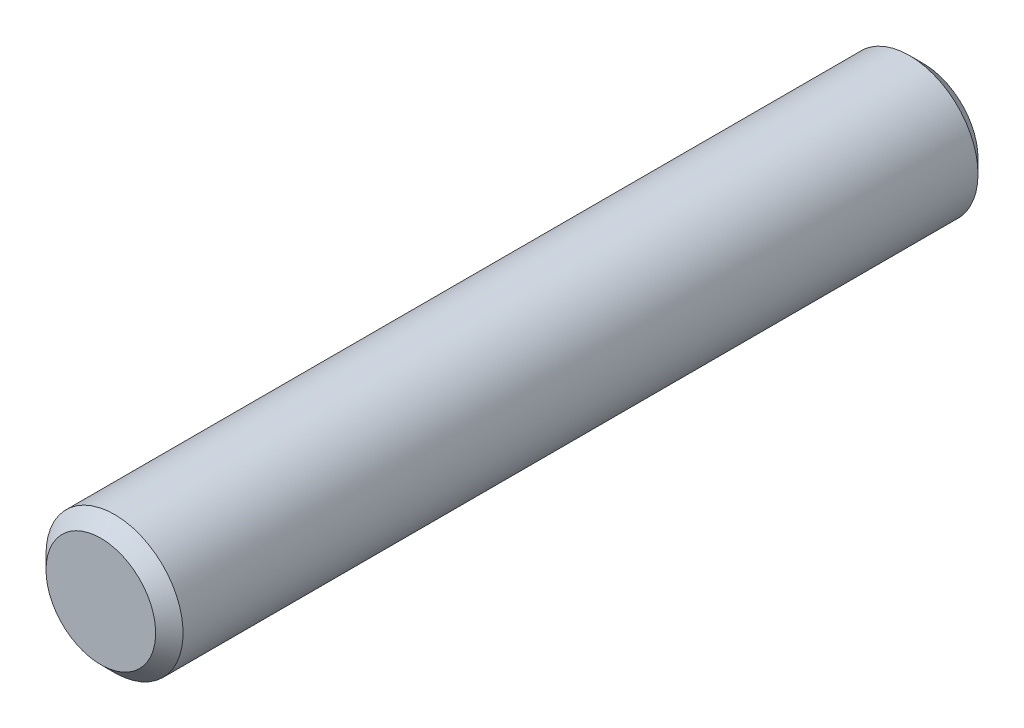
ISO-10303-21;
HEADER;
FILE_DESCRIPTION(('STEP AP214'),'2;1');
FILE_NAME('part.step','',(''),(''),'','','');
FILE_SCHEMA(('AUTOMOTIVE_DESIGN { 1 0 10303 214 1 1 1 1 }'));
ENDSEC;
DATA;
#1=APPLICATION_CONTEXT('core data for automotive mechanical design processes');
#2=APPLICATION_PROTOCOL_DEFINITION('international standard','automotive_design',2000,#1);
#3=PRODUCT_CONTEXT('',#1,'mechanical');
#4=PRODUCT('Part','Part','',(#3));
#5=PRODUCT_RELATED_PRODUCT_CATEGORY('part','',(#4));
#6=PRODUCT_DEFINITION_FORMATION('','',#4);
#7=PRODUCT_DEFINITION_CONTEXT('part definition',#1,'design');
#8=PRODUCT_DEFINITION('design','',#6,#7);
#9=PRODUCT_DEFINITION_SHAPE('','',#8);
#10=(LENGTH_UNIT() NAMED_UNIT(*) SI_UNIT(.MILLI.,.METRE.));
#11=(NAMED_UNIT(*) PLANE_ANGLE_UNIT() SI_UNIT($,.RADIAN.));
#12=(NAMED_UNIT(*) SI_UNIT($,.STERADIAN.) SOLID_ANGLE_UNIT());
#13=UNCERTAINTY_MEASURE_WITH_UNIT(LENGTH_MEASURE(1.E-05),#10,'distance_accuracy_value','');
#14=(GEOMETRIC_REPRESENTATION_CONTEXT(3) GLOBAL_UNCERTAINTY_ASSIGNED_CONTEXT((#13)) GLOBAL_UNIT_ASSIGNED_CONTEXT((#10,
#11,#12)) REPRESENTATION_CONTEXT('',''));
#15=CARTESIAN_POINT('',(0.,0.,0.));
#16=DIRECTION('',(0.,0.,1.));
#17=DIRECTION('',(1.,0.,0.));
#18=AXIS2_PLACEMENT_3D('',#15,#16,#17);
#19=CARTESIAN_POINT('',(0.,0.,19.05));
#20=DIRECTION('',(0.,0.,-1.));
#21=DIRECTION('',(-1.,0.,0.));
#22=AXIS2_PLACEMENT_3D('',#19,#20,#21);
#23=CYLINDRICAL_SURFACE('',#22,3.175);
#24=CARTESIAN_POINT('',(0.,0.,-18.415));
#25=DIRECTION('',(0.,0.,1.));
#26=DIRECTION('',(1.,0.,0.));
#27=AXIS2_PLACEMENT_3D('',#24,#25,#26);
#28=CIRCLE('',#27,3.175);
#29=CARTESIAN_POINT('',(-3.175,0.,-18.415));
#30=VERTEX_POINT('',#29);
#31=EDGE_CURVE('E43',#30,#30,#28,.T.);
#32=CARTESIAN_POINT('',(0.,0.,18.415));
#33=DIRECTION('',(0.,0.,1.));
#34=DIRECTION('',(1.,0.,0.));
#35=AXIS2_PLACEMENT_3D('',#32,#33,#34);
#36=CIRCLE('',#35,3.175);
#37=CARTESIAN_POINT('',(-3.175,0.,18.415));
#38=VERTEX_POINT('',#37);
#39=EDGE_CURVE('E47',#38,#38,#36,.F.);
#40=CARTESIAN_POINT('',(-3.175,0.,-18.415));
#41=CARTESIAN_POINT('',(-3.175,0.,-18.0313541666666));
#42=CARTESIAN_POINT('',(-3.175,0.,-17.6477083333333));
#43=CARTESIAN_POINT('',(-3.175,0.,-16.8804166666666));
#44=CARTESIAN_POINT('',(-3.175,0.,-16.4967708333333));
#45=CARTESIAN_POINT('',(-3.175,0.,-15.7294791666666));
#46=CARTESIAN_POINT('',(-3.175,0.,-15.3458333333333));
#47=CARTESIAN_POINT('',(-3.175,0.,-14.5785416666666));
#48=CARTESIAN_POINT('',(-3.175,0.,-14.1948958333333));
#49=CARTESIAN_POINT('',(-3.175,0.,-13.4276041666666));
#50=CARTESIAN_POINT('',(-3.175,0.,-13.0439583333333));
#51=CARTESIAN_POINT('',(-3.175,0.,-12.2766666666666));
#52=CARTESIAN_POINT('',(-3.175,0.,-11.8930208333333));
#53=CARTESIAN_POINT('',(-3.175,0.,-11.1257291666666));
#54=CARTESIAN_POINT('',(-3.175,0.,-10.7420833333333));
#55=CARTESIAN_POINT('',(-3.175,0.,-9.97479166666665));
#56=CARTESIAN_POINT('',(-3.175,0.,-9.59114583333331));
#57=CARTESIAN_POINT('',(-3.175,0.,-8.82385416666665));
#58=CARTESIAN_POINT('',(-3.175,0.,-8.44020833333331));
#59=CARTESIAN_POINT('',(-3.175,0.,-7.67291666666664));
#60=CARTESIAN_POINT('',(-3.175,0.,-7.28927083333331));
#61=CARTESIAN_POINT('',(-3.175,0.,-6.52197916666665));
#62=CARTESIAN_POINT('',(-3.175,0.,-6.13833333333331));
#63=CARTESIAN_POINT('',(-3.175,0.,-5.37104166666665));
#64=CARTESIAN_POINT('',(-3.175,0.,-4.98739583333331));
#65=CARTESIAN_POINT('',(-3.175,0.,-4.22010416666665));
#66=CARTESIAN_POINT('',(-3.175,0.,-3.83645833333331));
#67=CARTESIAN_POINT('',(-3.175,0.,-3.06916666666665));
#68=CARTESIAN_POINT('',(-3.175,0.,-2.68552083333331));
#69=CARTESIAN_POINT('',(-3.175,0.,-1.91822916666665));
#70=CARTESIAN_POINT('',(-3.175,0.,-1.53458333333331));
#71=CARTESIAN_POINT('',(-3.175,0.,-0.767291666666646));
#72=CARTESIAN_POINT('',(-3.175,0.,-0.383645833333313));
#73=CARTESIAN_POINT('',(-3.175,0.,0.383645833333354));
#74=CARTESIAN_POINT('',(-3.175,0.,0.767291666666688));
#75=CARTESIAN_POINT('',(-3.175,0.,1.53458333333336));
#76=CARTESIAN_POINT('',(-3.175,0.,1.91822916666669));
#77=CARTESIAN_POINT('',(-3.175,0.,2.68552083333335));
#78=CARTESIAN_POINT('',(-3.175,0.,3.06916666666669));
#79=CARTESIAN_POINT('',(-3.175,0.,3.83645833333335));
#80=CARTESIAN_POINT('',(-3.175,0.,4.22010416666668));
#81=CARTESIAN_POINT('',(-3.175,0.,4.98739583333335));
#82=CARTESIAN_POINT('',(-3.175,0.,5.37104166666669));
#83=CARTESIAN_POINT('',(-3.175,0.,6.13833333333335));
#84=CARTESIAN_POINT('',(-3.175,0.,6.52197916666669));
#85=CARTESIAN_POINT('',(-3.175,0.,7.28927083333335));
#86=CARTESIAN_POINT('',(-3.175,0.,7.67291666666668));
#87=CARTESIAN_POINT('',(-3.175,0.,8.44020833333335));
#88=CARTESIAN_POINT('',(-3.175,0.,8.82385416666669));
#89=CARTESIAN_POINT('',(-3.175,0.,9.59114583333335));
#90=CARTESIAN_POINT('',(-3.175,0.,9.97479166666669));
#91=CARTESIAN_POINT('',(-3.175,0.,10.7420833333334));
#92=CARTESIAN_POINT('',(-3.175,0.,11.1257291666667));
#93=CARTESIAN_POINT('',(-3.175,0.,11.8930208333334));
#94=CARTESIAN_POINT('',(-3.175,0.,12.2766666666667));
#95=CARTESIAN_POINT('',(-3.175,0.,13.0439583333334));
#96=CARTESIAN_POINT('',(-3.175,0.,13.4276041666667));
#97=CARTESIAN_POINT('',(-3.175,0.,14.1948958333333));
#98=CARTESIAN_POINT('',(-3.175,0.,14.5785416666667));
#99=CARTESIAN_POINT('',(-3.175,0.,15.3458333333334));
#100=CARTESIAN_POINT('',(-3.175,0.,15.7294791666667));
#101=CARTESIAN_POINT('',(-3.175,0.,16.4967708333334));
#102=CARTESIAN_POINT('',(-3.175,0.,16.8804166666667));
#103=CARTESIAN_POINT('',(-3.175,0.,17.6477083333334));
#104=CARTESIAN_POINT('',(-3.175,0.,18.0313541666667));
#105=CARTESIAN_POINT('',(-3.175,0.,18.415));
#106=B_SPLINE_CURVE_WITH_KNOTS('',3,(#40,#41,#42,#43,#44,#45,#46,#47,#48,#49,#50,#51,#52,#53,
#54,#55,#56,#57,#58,#59,#60,#61,#62,#63,#64,#65,#66,#67,#68,#69,#70,#71,#72,#73,#74,#75,#76,#77,
#78,#79,#80,#81,#82,#83,#84,#85,#86,#87,#88,#89,#90,#91,#92,#93,#94,#95,#96,#97,#98,#99,#100,
#101,#102,#103,#104,#105),.UNSPECIFIED.,.F.,.F.,(4,2,2,2,2,2,2,2,2,2,2,2,2,2,2,2,2,2,2,2,2,2,2,
2,2,2,2,2,2,2,2,2,4),(0.,1.1509375,2.301875,3.4528125,4.60375,5.7546875,6.905625,8.0565625,
9.2075,10.3584375,11.509375,12.6603125,13.81125,14.9621875,16.113125,17.2640625,18.415,
19.5659375,20.716875,21.8678125,23.01875,24.1696875,25.320625,26.4715625,27.6225,28.7734375,
29.924375,31.0753125,32.22625,33.3771875,34.528125,35.6790625,36.83),.UNSPECIFIED.);
#107=EDGE_CURVE('BSEAM32',#30,#38,#106,.T.);
#108=ORIENTED_EDGE('',*,*,#31,.T.);
#109=ORIENTED_EDGE('',*,*,#39,.T.);
#110=ORIENTED_EDGE('',*,*,#107,.T.);
#111=ORIENTED_EDGE('',*,*,#107,.F.);
#112=EDGE_LOOP('',(#108,#110,#109,#111));
#113=FACE_BOUND('',#112,.T.);
#114=ADVANCED_FACE('F32',(#113),#23,.T.);
#115=CARTESIAN_POINT('',(0.,0.,19.05));
#116=DIRECTION('',(0.,0.,1.));
#117=DIRECTION('',(1.,0.,0.));
#118=AXIS2_PLACEMENT_3D('',#115,#116,#117);
#119=PLANE('',#118);
#120=CARTESIAN_POINT('',(0.,0.,19.05));
#121=DIRECTION('',(0.,0.,1.));
#122=DIRECTION('',(1.,0.,0.));
#123=AXIS2_PLACEMENT_3D('',#120,#121,#122);
#124=CIRCLE('',#123,2.54000000000002);
#125=CARTESIAN_POINT('',(-2.54000000000002,0.,19.05));
#126=VERTEX_POINT('',#125);
#127=EDGE_CURVE('E10',#126,#126,#124,.T.);
#128=ORIENTED_EDGE('',*,*,#127,.T.);
#129=EDGE_LOOP('',(#128));
#130=FACE_BOUND('',#129,.T.);
#131=ADVANCED_FACE('F63',(#130),#119,.T.);
#132=CARTESIAN_POINT('',(0.,0.,-19.05));
#133=DIRECTION('',(0.,0.,1.));
#134=DIRECTION('',(1.,0.,0.));
#135=AXIS2_PLACEMENT_3D('',#132,#133,#134);
#136=PLANE('',#135);
#137=CARTESIAN_POINT('',(0.,0.,-19.05));
#138=DIRECTION('',(0.,0.,1.));
#139=DIRECTION('',(1.,0.,0.));
#140=AXIS2_PLACEMENT_3D('',#137,#138,#139);
#141=CIRCLE('',#140,2.53999999999997);
#142=CARTESIAN_POINT('',(2.53999999999997,0.,-19.05));
#143=VERTEX_POINT('',#142);
#144=EDGE_CURVE('E39',#143,#143,#141,.F.);
#145=ORIENTED_EDGE('',*,*,#144,.T.);
#146=EDGE_LOOP('',(#145));
#147=FACE_BOUND('',#146,.T.);
#148=ADVANCED_FACE('F60',(#147),#136,.F.);
#149=CARTESIAN_POINT('',(0.,0.,-18.415));
#150=DIRECTION('',(0.,0.,1.));
#151=DIRECTION('',(1.,0.,0.));
#152=AXIS2_PLACEMENT_3D('',#149,#150,#151);
#153=CONICAL_SURFACE('',#152,3.175,0.785398163397454);
#154=ORIENTED_EDGE('',*,*,#144,.F.);
#155=EDGE_LOOP('',(#154));
#156=FACE_BOUND('',#155,.T.);
#157=ORIENTED_EDGE('',*,*,#31,.F.);
#158=EDGE_LOOP('',(#157));
#159=FACE_BOUND('',#158,.T.);
#160=ADVANCED_FACE('F56',(#156,#159),#153,.T.);
#161=CARTESIAN_POINT('',(0.,0.,19.05));
#162=DIRECTION('',(0.,0.,-1.));
#163=DIRECTION('',(-1.,0.,0.));
#164=AXIS2_PLACEMENT_3D('',#161,#162,#163);
#165=CONICAL_SURFACE('',#164,2.54000000000002,0.785398163397448);
#166=CARTESIAN_POINT('',(-3.175,0.,18.415));
#167=CARTESIAN_POINT('',(-3.16838541666667,0.,18.4216145833334));
#168=CARTESIAN_POINT('',(-3.16177083333334,0.,18.4282291666667));
#169=CARTESIAN_POINT('',(-3.14854166666667,0.,18.4414583333333));
#170=CARTESIAN_POINT('',(-3.14192708333334,0.,18.4480729166667));
#171=CARTESIAN_POINT('',(-3.12869791666667,0.,18.4613020833334));
#172=CARTESIAN_POINT('',(-3.12208333333334,0.,18.4679166666667));
#173=CARTESIAN_POINT('',(-3.10885416666667,0.,18.4811458333333));
#174=CARTESIAN_POINT('',(-3.10223958333334,0.,18.4877604166667));
#175=CARTESIAN_POINT('',(-3.08901041666667,0.,18.5009895833333));
#176=CARTESIAN_POINT('',(-3.08239583333334,0.,18.5076041666667));
#177=CARTESIAN_POINT('',(-3.06916666666667,0.,18.5208333333333));
#178=CARTESIAN_POINT('',(-3.06255208333334,0.,18.5274479166667));
#179=CARTESIAN_POINT('',(-3.04932291666667,0.,18.5406770833333));
#180=CARTESIAN_POINT('',(-3.04270833333334,0.,18.5472916666667));
#181=CARTESIAN_POINT('',(-3.02947916666667,0.,18.5605208333333));
#182=CARTESIAN_POINT('',(-3.02286458333334,0.,18.5671354166667));
#183=CARTESIAN_POINT('',(-3.00963541666667,0.,18.5803645833333));
#184=CARTESIAN_POINT('',(-3.00302083333334,0.,18.5869791666667));
#185=CARTESIAN_POINT('',(-2.98979166666667,0.,18.6002083333333));
#186=CARTESIAN_POINT('',(-2.98317708333334,0.,18.6068229166667));
#187=CARTESIAN_POINT('',(-2.96994791666667,0.,18.6200520833333));
#188=CARTESIAN_POINT('',(-2.96333333333334,0.,18.6266666666667));
#189=CARTESIAN_POINT('',(-2.95010416666667,0.,18.6398958333333));
#190=CARTESIAN_POINT('',(-2.94348958333334,0.,18.6465104166667));
#191=CARTESIAN_POINT('',(-2.93026041666667,0.,18.6597395833333));
#192=CARTESIAN_POINT('',(-2.92364583333334,0.,18.6663541666667));
#193=CARTESIAN_POINT('',(-2.91041666666668,0.,18.6795833333333));
#194=CARTESIAN_POINT('',(-2.90380208333334,0.,18.6861979166667));
#195=CARTESIAN_POINT('',(-2.89057291666668,0.,18.6994270833333));
#196=CARTESIAN_POINT('',(-2.88395833333334,0.,18.7060416666667));
#197=CARTESIAN_POINT('',(-2.87072916666668,0.,18.7192708333333));
#198=CARTESIAN_POINT('',(-2.86411458333334,0.,18.7258854166667));
#199=CARTESIAN_POINT('',(-2.85088541666668,0.,18.7391145833333));
#200=CARTESIAN_POINT('',(-2.84427083333334,0.,18.7457291666667));
#201=CARTESIAN_POINT('',(-2.83104166666668,0.,18.7589583333333));
#202=CARTESIAN_POINT('',(-2.82442708333334,0.,18.7655729166667));
#203=CARTESIAN_POINT('',(-2.81119791666668,0.,18.7788020833333));
#204=CARTESIAN_POINT('',(-2.80458333333335,0.,18.7854166666667));
#205=CARTESIAN_POINT('',(-2.79135416666668,0.,18.7986458333333));
#206=CARTESIAN_POINT('',(-2.78473958333335,0.,18.8052604166667));
#207=CARTESIAN_POINT('',(-2.77151041666668,0.,18.8184895833333));
#208=CARTESIAN_POINT('',(-2.76489583333335,0.,18.8251041666667));
#209=CARTESIAN_POINT('',(-2.75166666666668,0.,18.8383333333333));
#210=CARTESIAN_POINT('',(-2.74505208333335,0.,18.8449479166667));
#211=CARTESIAN_POINT('',(-2.73182291666668,0.,18.8581770833333));
#212=CARTESIAN_POINT('',(-2.72520833333335,0.,18.8647916666667));
#213=CARTESIAN_POINT('',(-2.71197916666668,0.,18.8780208333333));
#214=CARTESIAN_POINT('',(-2.70536458333335,0.,18.8846354166667));
#215=CARTESIAN_POINT('',(-2.69213541666668,0.,18.8978645833333));
#216=CARTESIAN_POINT('',(-2.68552083333335,0.,18.9044791666667));
#217=CARTESIAN_POINT('',(-2.67229166666668,0.,18.9177083333333));
#218=CARTESIAN_POINT('',(-2.66567708333335,0.,18.9243229166667));
#219=CARTESIAN_POINT('',(-2.65244791666668,0.,18.9375520833333));
#220=CARTESIAN_POINT('',(-2.64583333333335,0.,18.9441666666667));
#221=CARTESIAN_POINT('',(-2.63260416666668,0.,18.9573958333333));
#222=CARTESIAN_POINT('',(-2.62598958333335,0.,18.9640104166667));
#223=CARTESIAN_POINT('',(-2.61276041666668,0.,18.9772395833333));
#224=CARTESIAN_POINT('',(-2.60614583333335,0.,18.9838541666667));
#225=CARTESIAN_POINT('',(-2.59291666666668,0.,18.9970833333333));
#226=CARTESIAN_POINT('',(-2.58630208333335,0.,19.0036979166667));
#227=CARTESIAN_POINT('',(-2.57307291666669,0.,19.0169270833333));
#228=CARTESIAN_POINT('',(-2.56645833333335,0.,19.0235416666667));
#229=CARTESIAN_POINT('',(-2.55322916666668,0.,19.0367708333333));
#230=CARTESIAN_POINT('',(-2.54661458333335,0.,19.0433854166667));
#231=CARTESIAN_POINT('',(-2.54000000000002,0.,19.05));
#232=B_SPLINE_CURVE_WITH_KNOTS('',3,(#166,#167,#168,#169,#170,#171,#172,#173,#174,#175,#176,
#177,#178,#179,#180,#181,#182,#183,#184,#185,#186,#187,#188,#189,#190,#191,#192,#193,#194,#195,
#196,#197,#198,#199,#200,#201,#202,#203,#204,#205,#206,#207,#208,#209,#210,#211,#212,#213,#214,
#215,#216,#217,#218,#219,#220,#221,#222,#223,#224,#225,#226,#227,#228,#229,#230,#231),
.UNSPECIFIED.,.F.,.F.,(4,2,2,2,2,2,2,2,2,2,2,2,2,2,2,2,2,2,2,2,2,2,2,2,2,2,2,2,2,2,2,2,4),(0.,
0.0280633003783394,0.0561266007566788,0.0841899011350207,0.11225320151336,0.1403165018917,
0.168379802270041,0.196443102648381,0.224506403026723,0.252569703405062,0.280633003783402,
0.308696304161743,0.336759604540083,0.364822904918422,0.392886205296764,0.420949505675103,
0.449012806053446,0.477076106431785,0.505139406810124,0.533202707188466,0.561266007566805,
0.589329307945145,0.617392608323487,0.645455908701826,0.673519209080168,0.701582509458508,
0.729645809836847,0.757709110215189,0.785772410593528,0.813835710971868,0.84189901135021,
0.869962311728549,0.898025612106891),.UNSPECIFIED.);
#233=EDGE_CURVE('BSEAM34',#38,#126,#232,.T.);
#234=ORIENTED_EDGE('',*,*,#39,.F.);
#235=ORIENTED_EDGE('',*,*,#127,.F.);
#236=ORIENTED_EDGE('',*,*,#233,.T.);
#237=ORIENTED_EDGE('',*,*,#233,.F.);
#238=EDGE_LOOP('',(#234,#236,#235,#237));
#239=FACE_BOUND('',#238,.T.);
#240=ADVANCED_FACE('F34',(#239),#165,.T.);
#241=CLOSED_SHELL('',(#114,#131,#148,#160,#240));
#242=MANIFOLD_SOLID_BREP('B2',#241);
#243=ADVANCED_BREP_SHAPE_REPRESENTATION('',(#18,#242),#14);
#244=SHAPE_DEFINITION_REPRESENTATION(#9,#243);
ENDSEC;
END-ISO-10303-21;
